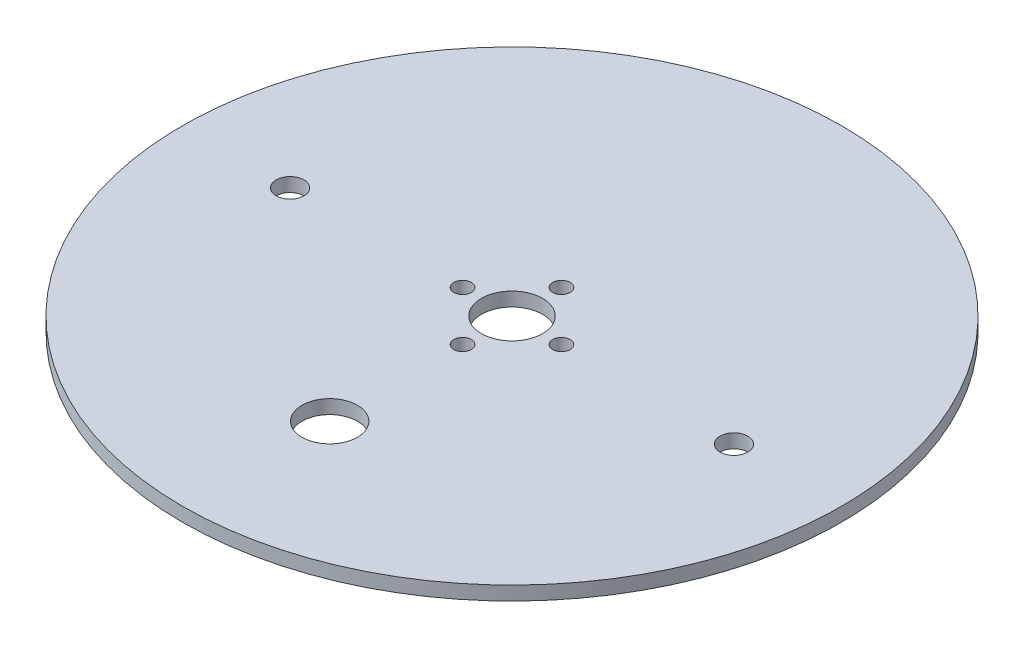
ISO-10303-21;
HEADER;
FILE_DESCRIPTION(('STEP AP214'),'2;1');
FILE_NAME('part.step','',(''),(''),'','','');
FILE_SCHEMA(('AUTOMOTIVE_DESIGN { 1 0 10303 214 1 1 1 1 }'));
ENDSEC;
DATA;
#1=APPLICATION_CONTEXT('core data for automotive mechanical design processes');
#2=APPLICATION_PROTOCOL_DEFINITION('international standard','automotive_design',2000,#1);
#3=PRODUCT_CONTEXT('',#1,'mechanical');
#4=PRODUCT('Part','Part','',(#3));
#5=PRODUCT_RELATED_PRODUCT_CATEGORY('part','',(#4));
#6=PRODUCT_DEFINITION_FORMATION('','',#4);
#7=PRODUCT_DEFINITION_CONTEXT('part definition',#1,'design');
#8=PRODUCT_DEFINITION('design','',#6,#7);
#9=PRODUCT_DEFINITION_SHAPE('','',#8);
#10=(LENGTH_UNIT() NAMED_UNIT(*) SI_UNIT(.MILLI.,.METRE.));
#11=(NAMED_UNIT(*) PLANE_ANGLE_UNIT() SI_UNIT($,.RADIAN.));
#12=(NAMED_UNIT(*) SI_UNIT($,.STERADIAN.) SOLID_ANGLE_UNIT());
#13=UNCERTAINTY_MEASURE_WITH_UNIT(LENGTH_MEASURE(1.E-05),#10,'distance_accuracy_value','');
#14=(GEOMETRIC_REPRESENTATION_CONTEXT(3) GLOBAL_UNCERTAINTY_ASSIGNED_CONTEXT((#13)) GLOBAL_UNIT_ASSIGNED_CONTEXT((#10,
#11,#12)) REPRESENTATION_CONTEXT('',''));
#15=CARTESIAN_POINT('',(0.,0.,0.));
#16=DIRECTION('',(0.,0.,1.));
#17=DIRECTION('',(1.,0.,0.));
#18=AXIS2_PLACEMENT_3D('',#15,#16,#17);
#19=CARTESIAN_POINT('',(0.,3.175,0.));
#20=DIRECTION('',(0.,-1.,0.));
#21=DIRECTION('',(0.,0.,-1.));
#22=AXIS2_PLACEMENT_3D('',#19,#20,#21);
#23=CYLINDRICAL_SURFACE('',#22,75.438);
#24=CARTESIAN_POINT('',(0.,3.175,0.));
#25=DIRECTION('',(0.,1.,0.));
#26=DIRECTION('',(0.,0.,1.));
#27=AXIS2_PLACEMENT_3D('',#24,#25,#26);
#28=CIRCLE('',#27,75.438);
#29=CARTESIAN_POINT('',(0.,3.175,75.438));
#30=VERTEX_POINT('',#29);
#31=EDGE_CURVE('E10',#30,#30,#28,.T.);
#32=ORIENTED_EDGE('',*,*,#31,.F.);
#33=EDGE_LOOP('',(#32));
#34=FACE_BOUND('',#33,.T.);
#35=CARTESIAN_POINT('',(0.,0.,0.));
#36=DIRECTION('',(0.,1.,0.));
#37=DIRECTION('',(0.,0.,1.));
#38=AXIS2_PLACEMENT_3D('',#35,#36,#37);
#39=CIRCLE('',#38,75.438);
#40=CARTESIAN_POINT('',(0.,0.,75.438));
#41=VERTEX_POINT('',#40);
#42=EDGE_CURVE('E34',#41,#41,#39,.T.);
#43=ORIENTED_EDGE('',*,*,#42,.T.);
#44=EDGE_LOOP('',(#43));
#45=FACE_BOUND('',#44,.T.);
#46=ADVANCED_FACE('F31',(#34,#45),#23,.T.);
#47=CARTESIAN_POINT('',(0.,3.175,0.));
#48=DIRECTION('',(0.,1.,0.));
#49=DIRECTION('',(0.,0.,1.));
#50=AXIS2_PLACEMENT_3D('',#47,#48,#49);
#51=PLANE('',#50);
#52=CARTESIAN_POINT('',(0.,3.175,41.7338254403277));
#53=DIRECTION('',(0.,1.,0.));
#54=DIRECTION('',(0.,0.,1.));
#55=AXIS2_PLACEMENT_3D('',#52,#53,#54);
#56=CIRCLE('',#55,6.34999999999999);
#57=CARTESIAN_POINT('',(0.,3.175,48.0838254403277));
#58=VERTEX_POINT('',#57);
#59=EDGE_CURVE('E87',#58,#58,#56,.T.);
#60=ORIENTED_EDGE('',*,*,#59,.F.);
#61=EDGE_LOOP('',(#60));
#62=FACE_BOUND('',#61,.T.);
#63=CARTESIAN_POINT('',(1.16061195586613E-13,3.175,11.314));
#64=DIRECTION('',(0.,1.,0.));
#65=DIRECTION('',(0.,0.,1.));
#66=AXIS2_PLACEMENT_3D('',#63,#64,#65);
#67=CIRCLE('',#66,2.);
#68=CARTESIAN_POINT('',(1.16061195586613E-13,3.175,13.314));
#69=VERTEX_POINT('',#68);
#70=EDGE_CURVE('E68',#69,#69,#67,.T.);
#71=ORIENTED_EDGE('',*,*,#70,.F.);
#72=EDGE_LOOP('',(#71));
#73=FACE_BOUND('',#72,.T.);
#74=CARTESIAN_POINT('',(-11.314,3.175,0.));
#75=DIRECTION('',(0.,1.,0.));
#76=DIRECTION('',(0.,0.,1.));
#77=AXIS2_PLACEMENT_3D('',#74,#75,#76);
#78=CIRCLE('',#77,2.);
#79=CARTESIAN_POINT('',(-11.314,3.175,2.00000000000008));
#80=VERTEX_POINT('',#79);
#81=EDGE_CURVE('E61',#80,#80,#78,.T.);
#82=ORIENTED_EDGE('',*,*,#81,.F.);
#83=EDGE_LOOP('',(#82));
#84=FACE_BOUND('',#83,.T.);
#85=CARTESIAN_POINT('',(11.314,3.175,0.));
#86=DIRECTION('',(0.,1.,0.));
#87=DIRECTION('',(0.,0.,1.));
#88=AXIS2_PLACEMENT_3D('',#85,#86,#87);
#89=CIRCLE('',#88,2.);
#90=CARTESIAN_POINT('',(11.314,3.175,2.));
#91=VERTEX_POINT('',#90);
#92=EDGE_CURVE('E80',#91,#91,#89,.T.);
#93=ORIENTED_EDGE('',*,*,#92,.F.);
#94=EDGE_LOOP('',(#93));
#95=FACE_BOUND('',#94,.T.);
#96=CARTESIAN_POINT('',(0.,3.175,-11.314));
#97=DIRECTION('',(0.,1.,0.));
#98=DIRECTION('',(0.,0.,1.));
#99=AXIS2_PLACEMENT_3D('',#96,#97,#98);
#100=CIRCLE('',#99,2.);
#101=CARTESIAN_POINT('',(0.,3.175,-9.314));
#102=VERTEX_POINT('',#101);
#103=EDGE_CURVE('E73',#102,#102,#100,.T.);
#104=ORIENTED_EDGE('',*,*,#103,.F.);
#105=EDGE_LOOP('',(#104));
#106=FACE_BOUND('',#105,.T.);
#107=CARTESIAN_POINT('',(0.,3.175,0.));
#108=DIRECTION('',(0.,1.,0.));
#109=DIRECTION('',(0.,0.,1.));
#110=AXIS2_PLACEMENT_3D('',#107,#108,#109);
#111=CIRCLE('',#110,7.);
#112=CARTESIAN_POINT('',(0.,3.175,7.));
#113=VERTEX_POINT('',#112);
#114=EDGE_CURVE('E55',#113,#113,#111,.T.);
#115=ORIENTED_EDGE('',*,*,#114,.F.);
#116=EDGE_LOOP('',(#115));
#117=FACE_BOUND('',#116,.T.);
#118=CARTESIAN_POINT('',(-50.8,3.175,0.));
#119=DIRECTION('',(0.,1.,0.));
#120=DIRECTION('',(0.,0.,-1.));
#121=AXIS2_PLACEMENT_3D('',#118,#119,#120);
#122=CIRCLE('',#121,3.175);
#123=CARTESIAN_POINT('',(-50.8,3.175,-3.175));
#124=VERTEX_POINT('',#123);
#125=EDGE_CURVE('E50',#124,#124,#122,.T.);
#126=ORIENTED_EDGE('',*,*,#125,.F.);
#127=EDGE_LOOP('',(#126));
#128=FACE_BOUND('',#127,.T.);
#129=CARTESIAN_POINT('',(50.8,3.175,0.));
#130=DIRECTION('',(0.,1.,0.));
#131=DIRECTION('',(0.,0.,1.));
#132=AXIS2_PLACEMENT_3D('',#129,#130,#131);
#133=CIRCLE('',#132,3.175);
#134=CARTESIAN_POINT('',(50.8,3.175,3.175));
#135=VERTEX_POINT('',#134);
#136=EDGE_CURVE('E43',#135,#135,#133,.T.);
#137=ORIENTED_EDGE('',*,*,#136,.F.);
#138=EDGE_LOOP('',(#137));
#139=FACE_BOUND('',#138,.T.);
#140=ORIENTED_EDGE('',*,*,#31,.T.);
#141=EDGE_LOOP('',(#140));
#142=FACE_BOUND('',#141,.T.);
#143=ADVANCED_FACE('F93',(#62,#73,#84,#95,#106,#117,#128,#139,#142),#51,.T.);
#144=CARTESIAN_POINT('',(0.,0.,0.));
#145=DIRECTION('',(0.,1.,0.));
#146=DIRECTION('',(0.,0.,1.));
#147=AXIS2_PLACEMENT_3D('',#144,#145,#146);
#148=PLANE('',#147);
#149=CARTESIAN_POINT('',(0.,0.,41.7338254403277));
#150=DIRECTION('',(0.,1.,0.));
#151=DIRECTION('',(0.,0.,1.));
#152=AXIS2_PLACEMENT_3D('',#149,#150,#151);
#153=CIRCLE('',#152,6.34999999999999);
#154=CARTESIAN_POINT('',(0.,0.,48.0838254403277));
#155=VERTEX_POINT('',#154);
#156=EDGE_CURVE('E77',#155,#155,#153,.T.);
#157=ORIENTED_EDGE('',*,*,#156,.T.);
#158=EDGE_LOOP('',(#157));
#159=FACE_BOUND('',#158,.T.);
#160=CARTESIAN_POINT('',(1.16061195586613E-13,0.,11.314));
#161=DIRECTION('',(0.,1.,0.));
#162=DIRECTION('',(0.,0.,1.));
#163=AXIS2_PLACEMENT_3D('',#160,#161,#162);
#164=CIRCLE('',#163,2.);
#165=CARTESIAN_POINT('',(1.16061195586613E-13,0.,13.314));
#166=VERTEX_POINT('',#165);
#167=EDGE_CURVE('E58',#166,#166,#164,.T.);
#168=ORIENTED_EDGE('',*,*,#167,.T.);
#169=EDGE_LOOP('',(#168));
#170=FACE_BOUND('',#169,.T.);
#171=CARTESIAN_POINT('',(-11.314,0.,0.));
#172=DIRECTION('',(0.,1.,0.));
#173=DIRECTION('',(0.,0.,1.));
#174=AXIS2_PLACEMENT_3D('',#171,#172,#173);
#175=CIRCLE('',#174,2.);
#176=CARTESIAN_POINT('',(-11.314,0.,2.00000000000008));
#177=VERTEX_POINT('',#176);
#178=EDGE_CURVE('E64',#177,#177,#175,.T.);
#179=ORIENTED_EDGE('',*,*,#178,.T.);
#180=EDGE_LOOP('',(#179));
#181=FACE_BOUND('',#180,.T.);
#182=CARTESIAN_POINT('',(11.314,0.,0.));
#183=DIRECTION('',(0.,1.,0.));
#184=DIRECTION('',(0.,0.,1.));
#185=AXIS2_PLACEMENT_3D('',#182,#183,#184);
#186=CIRCLE('',#185,2.);
#187=CARTESIAN_POINT('',(11.314,0.,2.));
#188=VERTEX_POINT('',#187);
#189=EDGE_CURVE('E65',#188,#188,#186,.T.);
#190=ORIENTED_EDGE('',*,*,#189,.T.);
#191=EDGE_LOOP('',(#190));
#192=FACE_BOUND('',#191,.T.);
#193=CARTESIAN_POINT('',(0.,0.,-11.314));
#194=DIRECTION('',(0.,1.,0.));
#195=DIRECTION('',(0.,0.,1.));
#196=AXIS2_PLACEMENT_3D('',#193,#194,#195);
#197=CIRCLE('',#196,2.);
#198=CARTESIAN_POINT('',(0.,0.,-9.314));
#199=VERTEX_POINT('',#198);
#200=EDGE_CURVE('E76',#199,#199,#197,.T.);
#201=ORIENTED_EDGE('',*,*,#200,.T.);
#202=EDGE_LOOP('',(#201));
#203=FACE_BOUND('',#202,.T.);
#204=CARTESIAN_POINT('',(0.,0.,0.));
#205=DIRECTION('',(0.,1.,0.));
#206=DIRECTION('',(0.,0.,1.));
#207=AXIS2_PLACEMENT_3D('',#204,#205,#206);
#208=CIRCLE('',#207,7.);
#209=CARTESIAN_POINT('',(0.,0.,7.));
#210=VERTEX_POINT('',#209);
#211=EDGE_CURVE('E47',#210,#210,#208,.T.);
#212=ORIENTED_EDGE('',*,*,#211,.T.);
#213=EDGE_LOOP('',(#212));
#214=FACE_BOUND('',#213,.T.);
#215=CARTESIAN_POINT('',(-50.8,0.,0.));
#216=DIRECTION('',(0.,1.,0.));
#217=DIRECTION('',(0.,0.,-1.));
#218=AXIS2_PLACEMENT_3D('',#215,#216,#217);
#219=CIRCLE('',#218,3.175);
#220=CARTESIAN_POINT('',(-50.8,0.,-3.175));
#221=VERTEX_POINT('',#220);
#222=EDGE_CURVE('E41',#221,#221,#219,.T.);
#223=ORIENTED_EDGE('',*,*,#222,.T.);
#224=EDGE_LOOP('',(#223));
#225=FACE_BOUND('',#224,.T.);
#226=CARTESIAN_POINT('',(50.8,0.,0.));
#227=DIRECTION('',(0.,1.,0.));
#228=DIRECTION('',(0.,0.,1.));
#229=AXIS2_PLACEMENT_3D('',#226,#227,#228);
#230=CIRCLE('',#229,3.175);
#231=CARTESIAN_POINT('',(50.8,0.,3.175));
#232=VERTEX_POINT('',#231);
#233=EDGE_CURVE('E46',#232,#232,#230,.T.);
#234=ORIENTED_EDGE('',*,*,#233,.T.);
#235=EDGE_LOOP('',(#234));
#236=FACE_BOUND('',#235,.T.);
#237=ORIENTED_EDGE('',*,*,#42,.F.);
#238=EDGE_LOOP('',(#237));
#239=FACE_BOUND('',#238,.T.);
#240=ADVANCED_FACE('F96',(#159,#170,#181,#192,#203,#214,#225,#236,#239),#148,.F.);
#241=CARTESIAN_POINT('',(50.8,0.,0.));
#242=DIRECTION('',(0.,1.,0.));
#243=DIRECTION('',(0.,0.,1.));
#244=AXIS2_PLACEMENT_3D('',#241,#242,#243);
#245=CYLINDRICAL_SURFACE('',#244,3.175);
#246=ORIENTED_EDGE('',*,*,#233,.F.);
#247=EDGE_LOOP('',(#246));
#248=FACE_BOUND('',#247,.T.);
#249=ORIENTED_EDGE('',*,*,#136,.T.);
#250=EDGE_LOOP('',(#249));
#251=FACE_BOUND('',#250,.T.);
#252=ADVANCED_FACE('F112',(#248,#251),#245,.F.);
#253=CARTESIAN_POINT('',(-50.8,0.,0.));
#254=DIRECTION('',(0.,1.,0.));
#255=DIRECTION('',(0.,0.,1.));
#256=AXIS2_PLACEMENT_3D('',#253,#254,#255);
#257=CYLINDRICAL_SURFACE('',#256,3.175);
#258=ORIENTED_EDGE('',*,*,#222,.F.);
#259=EDGE_LOOP('',(#258));
#260=FACE_BOUND('',#259,.T.);
#261=ORIENTED_EDGE('',*,*,#125,.T.);
#262=EDGE_LOOP('',(#261));
#263=FACE_BOUND('',#262,.T.);
#264=ADVANCED_FACE('F114',(#260,#263),#257,.F.);
#265=CARTESIAN_POINT('',(0.,0.,0.));
#266=DIRECTION('',(0.,1.,0.));
#267=DIRECTION('',(0.,0.,1.));
#268=AXIS2_PLACEMENT_3D('',#265,#266,#267);
#269=CYLINDRICAL_SURFACE('',#268,7.);
#270=ORIENTED_EDGE('',*,*,#211,.F.);
#271=EDGE_LOOP('',(#270));
#272=FACE_BOUND('',#271,.T.);
#273=ORIENTED_EDGE('',*,*,#114,.T.);
#274=EDGE_LOOP('',(#273));
#275=FACE_BOUND('',#274,.T.);
#276=ADVANCED_FACE('F121',(#272,#275),#269,.F.);
#277=CARTESIAN_POINT('',(0.,0.,-11.314));
#278=DIRECTION('',(0.,1.,0.));
#279=DIRECTION('',(0.,0.,1.));
#280=AXIS2_PLACEMENT_3D('',#277,#278,#279);
#281=CYLINDRICAL_SURFACE('',#280,2.);
#282=ORIENTED_EDGE('',*,*,#200,.F.);
#283=EDGE_LOOP('',(#282));
#284=FACE_BOUND('',#283,.T.);
#285=ORIENTED_EDGE('',*,*,#103,.T.);
#286=EDGE_LOOP('',(#285));
#287=FACE_BOUND('',#286,.T.);
#288=ADVANCED_FACE('F176',(#284,#287),#281,.F.);
#289=CARTESIAN_POINT('',(11.314,0.,0.));
#290=DIRECTION('',(0.,1.,0.));
#291=DIRECTION('',(0.,0.,1.));
#292=AXIS2_PLACEMENT_3D('',#289,#290,#291);
#293=CYLINDRICAL_SURFACE('',#292,2.);
#294=ORIENTED_EDGE('',*,*,#189,.F.);
#295=EDGE_LOOP('',(#294));
#296=FACE_BOUND('',#295,.T.);
#297=ORIENTED_EDGE('',*,*,#92,.T.);
#298=EDGE_LOOP('',(#297));
#299=FACE_BOUND('',#298,.T.);
#300=ADVANCED_FACE('F168',(#296,#299),#293,.F.);
#301=CARTESIAN_POINT('',(-11.314,0.,0.));
#302=DIRECTION('',(0.,1.,0.));
#303=DIRECTION('',(0.,0.,1.));
#304=AXIS2_PLACEMENT_3D('',#301,#302,#303);
#305=CYLINDRICAL_SURFACE('',#304,2.);
#306=ORIENTED_EDGE('',*,*,#178,.F.);
#307=EDGE_LOOP('',(#306));
#308=FACE_BOUND('',#307,.T.);
#309=ORIENTED_EDGE('',*,*,#81,.T.);
#310=EDGE_LOOP('',(#309));
#311=FACE_BOUND('',#310,.T.);
#312=ADVANCED_FACE('F161',(#308,#311),#305,.F.);
#313=CARTESIAN_POINT('',(1.16061195586613E-13,0.,11.314));
#314=DIRECTION('',(0.,1.,0.));
#315=DIRECTION('',(0.,0.,1.));
#316=AXIS2_PLACEMENT_3D('',#313,#314,#315);
#317=CYLINDRICAL_SURFACE('',#316,2.);
#318=ORIENTED_EDGE('',*,*,#167,.F.);
#319=EDGE_LOOP('',(#318));
#320=FACE_BOUND('',#319,.T.);
#321=ORIENTED_EDGE('',*,*,#70,.T.);
#322=EDGE_LOOP('',(#321));
#323=FACE_BOUND('',#322,.T.);
#324=ADVANCED_FACE('F151',(#320,#323),#317,.F.);
#325=CARTESIAN_POINT('',(0.,3.175,41.7338254403277));
#326=DIRECTION('',(0.,1.,0.));
#327=DIRECTION('',(0.,0.,1.));
#328=AXIS2_PLACEMENT_3D('',#325,#326,#327);
#329=CYLINDRICAL_SURFACE('',#328,6.34999999999999);
#330=ORIENTED_EDGE('',*,*,#156,.F.);
#331=EDGE_LOOP('',(#330));
#332=FACE_BOUND('',#331,.T.);
#333=ORIENTED_EDGE('',*,*,#59,.T.);
#334=EDGE_LOOP('',(#333));
#335=FACE_BOUND('',#334,.T.);
#336=ADVANCED_FACE('F91',(#332,#335),#329,.F.);
#337=CLOSED_SHELL('',(#46,#143,#240,#252,#264,#276,#288,#300,#312,#324,#336));
#338=MANIFOLD_SOLID_BREP('B2',#337);
#339=ADVANCED_BREP_SHAPE_REPRESENTATION('',(#18,#338),#14);
#340=SHAPE_DEFINITION_REPRESENTATION(#9,#339);
ENDSEC;
END-ISO-10303-21;
